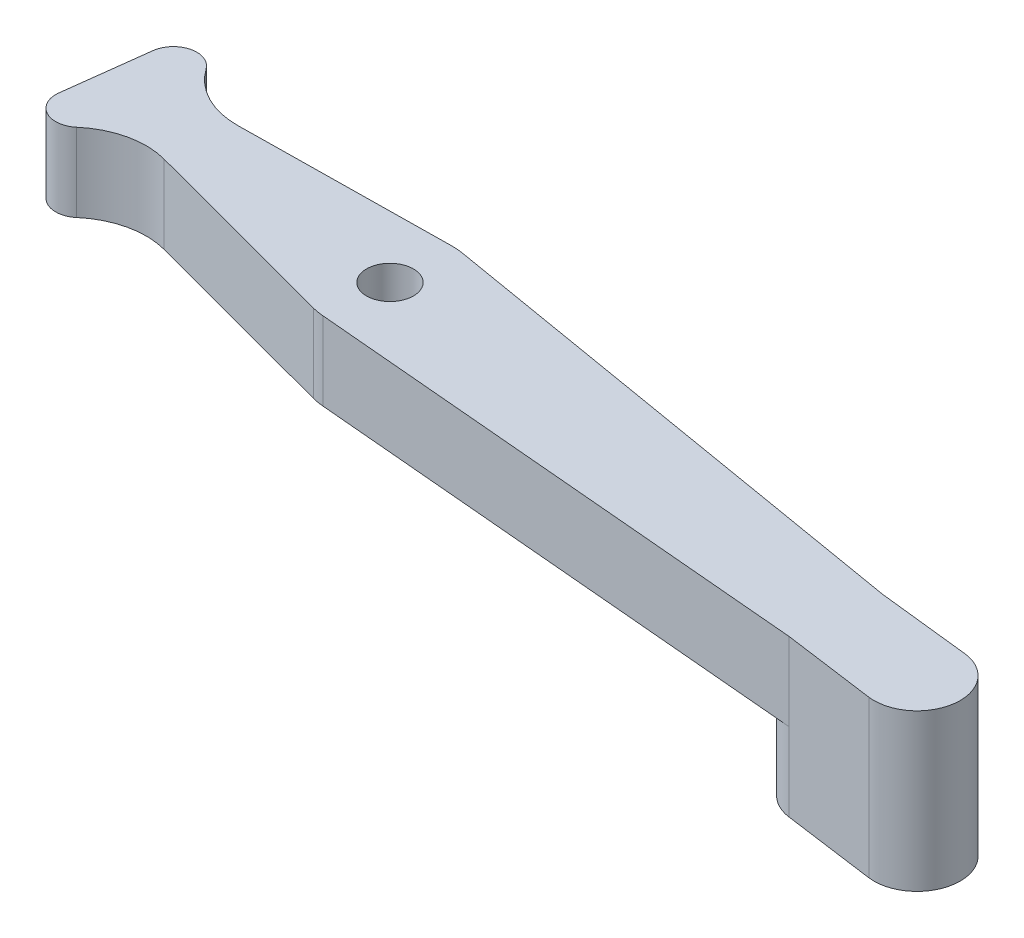
ISO-10303-21;
HEADER;
FILE_DESCRIPTION(('STEP AP214'),'2;1');
FILE_NAME('part.step','',(''),(''),'','','');
FILE_SCHEMA(('AUTOMOTIVE_DESIGN { 1 0 10303 214 1 1 1 1 }'));
ENDSEC;
DATA;
#1=APPLICATION_CONTEXT('core data for automotive mechanical design processes');
#2=APPLICATION_PROTOCOL_DEFINITION('international standard','automotive_design',2000,#1);
#3=PRODUCT_CONTEXT('',#1,'mechanical');
#4=PRODUCT('Part','Part','',(#3));
#5=PRODUCT_RELATED_PRODUCT_CATEGORY('part','',(#4));
#6=PRODUCT_DEFINITION_FORMATION('','',#4);
#7=PRODUCT_DEFINITION_CONTEXT('part definition',#1,'design');
#8=PRODUCT_DEFINITION('design','',#6,#7);
#9=PRODUCT_DEFINITION_SHAPE('','',#8);
#10=(LENGTH_UNIT() NAMED_UNIT(*) SI_UNIT(.MILLI.,.METRE.));
#11=(NAMED_UNIT(*) PLANE_ANGLE_UNIT() SI_UNIT($,.RADIAN.));
#12=(NAMED_UNIT(*) SI_UNIT($,.STERADIAN.) SOLID_ANGLE_UNIT());
#13=UNCERTAINTY_MEASURE_WITH_UNIT(LENGTH_MEASURE(1.E-05),#10,'distance_accuracy_value','');
#14=(GEOMETRIC_REPRESENTATION_CONTEXT(3) GLOBAL_UNCERTAINTY_ASSIGNED_CONTEXT((#13)) GLOBAL_UNIT_ASSIGNED_CONTEXT((#10,
#11,#12)) REPRESENTATION_CONTEXT('',''));
#15=CARTESIAN_POINT('',(0.,0.,0.));
#16=DIRECTION('',(0.,0.,1.));
#17=DIRECTION('',(1.,0.,0.));
#18=AXIS2_PLACEMENT_3D('',#15,#16,#17);
#19=CARTESIAN_POINT('',(20.0000002980301,-3.575342465325,55.0000000000125));
#20=DIRECTION('',(0.,-1.,0.));
#21=DIRECTION('',(-0.342020143325666,0.,-0.939692620785909));
#22=AXIS2_PLACEMENT_3D('',#19,#20,#21);
#23=CYLINDRICAL_SURFACE('',#22,1.50000000000011);
#24=CARTESIAN_POINT('',(20.0000002980301,-3.575342465325,55.0000000000125));
#25=DIRECTION('',(0.,-1.,0.));
#26=DIRECTION('',(-0.342020143325666,0.,-0.939692620785909));
#27=AXIS2_PLACEMENT_3D('',#24,#25,#26);
#28=CIRCLE('',#27,1.50000000000011);
#29=CARTESIAN_POINT('',(20.5130305130186,-3.575342465325,56.4095389311913));
#30=VERTEX_POINT('',#29);
#31=EDGE_CURVE('E276',#30,#30,#28,.T.);
#32=ORIENTED_EDGE('',*,*,#31,.F.);
#33=DIRECTION('',(0.,-1.,0.));
#34=VECTOR('',#33,1.);
#35=CARTESIAN_POINT('',(20.5130305130186,-3.575342465325,56.4095389311913));
#36=LINE('',#35,#34);
#37=CARTESIAN_POINT('',(20.5130305130186,-8.575342465325,56.4095389311913));
#38=VERTEX_POINT('',#37);
#39=EDGE_CURVE('E11',#30,#38,#36,.T.);
#40=ORIENTED_EDGE('',*,*,#39,.T.);
#41=CARTESIAN_POINT('',(20.0000002980301,-8.575342465325,55.0000000000125));
#42=DIRECTION('',(0.,-1.,0.));
#43=DIRECTION('',(-0.342020143325666,0.,-0.939692620785909));
#44=AXIS2_PLACEMENT_3D('',#41,#42,#43);
#45=CIRCLE('',#44,1.50000000000011);
#46=EDGE_CURVE('E267',#38,#38,#45,.T.);
#47=ORIENTED_EDGE('',*,*,#46,.T.);
#48=ORIENTED_EDGE('',*,*,#39,.F.);
#49=EDGE_LOOP('',(#32,#40,#47,#48));
#50=FACE_BOUND('',#49,.T.);
#51=ADVANCED_FACE('F17',(#50),#23,.F.);
#52=CARTESIAN_POINT('',(58.6145129467748,-13.575342465325,59.9186635199198));
#53=DIRECTION('',(0.,-1.,0.));
#54=DIRECTION('',(0.939692620785909,0.,-0.342020143325666));
#55=AXIS2_PLACEMENT_3D('',#52,#53,#54);
#56=PLANE('',#55);
#57=CARTESIAN_POINT('',(58.6145129467748,-13.575342465325,59.9186635199198));
#58=DIRECTION('',(0.,-1.,0.));
#59=DIRECTION('',(-0.342020143325666,0.,-0.939692620785909));
#60=AXIS2_PLACEMENT_3D('',#57,#58,#59);
#61=CIRCLE('',#60,2.75858306206178);
#62=CARTESIAN_POINT('',(58.9565307711655,-13.575342465325,57.1813647934204));
#63=VERTEX_POINT('',#62);
#64=CARTESIAN_POINT('',(58.2724951223841,-13.575342465325,62.655962246419));
#65=VERTEX_POINT('',#64);
#66=EDGE_CURVE('E178',#63,#65,#61,.T.);
#67=ORIENTED_EDGE('',*,*,#66,.T.);
#68=DIRECTION('',(-0.990669212726332,0.,-0.136288337564849));
#69=VECTOR('',#68,1.);
#70=CARTESIAN_POINT('',(52.3581257480847,-13.575342465325,61.8423106668508));
#71=LINE('',#70,#69);
#72=CARTESIAN_POINT('',(52.3581257480847,-13.575342465325,61.8423106668508));
#73=VERTEX_POINT('',#72);
#74=EDGE_CURVE('E184',#65,#73,#71,.T.);
#75=ORIENTED_EDGE('',*,*,#74,.T.);
#76=CARTESIAN_POINT('',(52.6906053268839,-13.575342465325,59.1816923708567));
#77=DIRECTION('',(0.,-1.,0.));
#78=DIRECTION('',(-0.342020143325666,0.,-0.939692620785909));
#79=AXIS2_PLACEMENT_3D('',#76,#77,#78);
#80=CIRCLE('',#79,2.68131169156073);
#81=CARTESIAN_POINT('',(53.0230849056696,-13.575342465325,56.5210740748565));
#82=VERTEX_POINT('',#81);
#83=EDGE_CURVE('E28',#73,#82,#80,.T.);
#84=ORIENTED_EDGE('',*,*,#83,.T.);
#85=DIRECTION('',(0.993864987501234,0.,0.110600120339779));
#86=VECTOR('',#85,1.);
#87=CARTESIAN_POINT('',(53.0230849056696,-13.575342465325,56.5210740748565));
#88=LINE('',#87,#86);
#89=EDGE_CURVE('E199',#82,#63,#88,.T.);
#90=ORIENTED_EDGE('',*,*,#89,.T.);
#91=EDGE_LOOP('',(#67,#75,#84,#90));
#92=FACE_BOUND('',#91,.T.);
#93=ADVANCED_FACE('F426',(#92),#56,.T.);
#94=CARTESIAN_POINT('',(52.6906053268839,-13.575342465325,59.1816923708567));
#95=DIRECTION('',(0.,1.,0.));
#96=DIRECTION('',(-0.992282361043559,0.,-0.123998854679468));
#97=AXIS2_PLACEMENT_3D('',#94,#95,#96);
#98=CYLINDRICAL_SURFACE('',#97,2.68131169156073);
#99=CARTESIAN_POINT('',(52.6906053268839,-8.575342465325,59.1816923708567));
#100=DIRECTION('',(0.,-1.,0.));
#101=DIRECTION('',(-0.342020143325666,0.,-0.939692620785909));
#102=AXIS2_PLACEMENT_3D('',#99,#100,#101);
#103=CIRCLE('',#102,2.68131169156073);
#104=CARTESIAN_POINT('',(52.3581257480847,-8.575342465325,61.8423106668508));
#105=VERTEX_POINT('',#104);
#106=CARTESIAN_POINT('',(53.0230849056696,-8.575342465325,56.5210740748565));
#107=VERTEX_POINT('',#106);
#108=EDGE_CURVE('E109',#105,#107,#103,.T.);
#109=ORIENTED_EDGE('',*,*,#108,.T.);
#110=DIRECTION('',(0.,1.,0.));
#111=VECTOR('',#110,1.);
#112=CARTESIAN_POINT('',(53.0230849056696,-13.575342465325,56.5210740748565));
#113=LINE('',#112,#111);
#114=EDGE_CURVE('E193',#82,#107,#113,.T.);
#115=ORIENTED_EDGE('',*,*,#114,.F.);
#116=ORIENTED_EDGE('',*,*,#83,.F.);
#117=DIRECTION('',(0.,1.,0.));
#118=VECTOR('',#117,1.);
#119=CARTESIAN_POINT('',(52.3581257480847,-13.575342465325,61.8423106668508));
#120=LINE('',#119,#118);
#121=EDGE_CURVE('E177',#73,#105,#120,.T.);
#122=ORIENTED_EDGE('',*,*,#121,.T.);
#123=EDGE_LOOP('',(#109,#115,#116,#122));
#124=FACE_BOUND('',#123,.T.);
#125=ADVANCED_FACE('F431',(#124),#98,.T.);
#126=CARTESIAN_POINT('',(20.0022288875852,-3.575342465325,55.0000201290001));
#127=DIRECTION('',(0.,-1.,0.));
#128=DIRECTION('',(0.939692620785909,0.,-0.342020143325666));
#129=AXIS2_PLACEMENT_3D('',#126,#127,#128);
#130=PLANE('',#129);
#131=ORIENTED_EDGE('',*,*,#31,.T.);
#132=EDGE_LOOP('',(#131));
#133=FACE_BOUND('',#132,.T.);
#134=DIRECTION('',(-0.996203883243687,0.,-0.0870506921867888));
#135=VECTOR('',#134,1.);
#136=CARTESIAN_POINT('',(52.3581257480847,-3.575342465325,61.8423106668508));
#137=LINE('',#136,#135);
#138=CARTESIAN_POINT('',(52.3581257480847,-3.575342465325,61.8423106668508));
#139=VERTEX_POINT('',#138);
#140=CARTESIAN_POINT('',(19.701769452364,-3.575342465325,58.9887196824597));
#141=VERTEX_POINT('',#140);
#142=EDGE_CURVE('E172',#139,#141,#137,.T.);
#143=ORIENTED_EDGE('',*,*,#142,.F.);
#144=DIRECTION('',(-0.990669212726332,0.,-0.136288337564849));
#145=VECTOR('',#144,1.);
#146=CARTESIAN_POINT('',(52.3581257480847,-3.575342465325,61.8423106668508));
#147=LINE('',#146,#145);
#148=CARTESIAN_POINT('',(58.2724951223841,-3.575342465325,62.655962246419));
#149=VERTEX_POINT('',#148);
#150=EDGE_CURVE('E168',#149,#139,#147,.T.);
#151=ORIENTED_EDGE('',*,*,#150,.F.);
#152=CARTESIAN_POINT('',(58.6145129467748,-3.575342465325,59.9186635199198));
#153=DIRECTION('',(0.,-1.,0.));
#154=DIRECTION('',(-0.342020143325666,0.,-0.939692620785909));
#155=AXIS2_PLACEMENT_3D('',#152,#153,#154);
#156=CIRCLE('',#155,2.75858306206178);
#157=CARTESIAN_POINT('',(58.9565307711655,-3.575342465325,57.1813647934204));
#158=VERTEX_POINT('',#157);
#159=EDGE_CURVE('E100',#158,#149,#156,.T.);
#160=ORIENTED_EDGE('',*,*,#159,.F.);
#161=DIRECTION('',(0.993864987501234,0.,0.110600120339779));
#162=VECTOR('',#161,1.);
#163=CARTESIAN_POINT('',(53.0230849056696,-3.575342465325,56.5210740748565));
#164=LINE('',#163,#162);
#165=CARTESIAN_POINT('',(53.0230849056696,-3.575342465325,56.5210740748565));
#166=VERTEX_POINT('',#165);
#167=EDGE_CURVE('E118',#166,#158,#164,.T.);
#168=ORIENTED_EDGE('',*,*,#167,.F.);
#169=DIRECTION('',(0.986034926068346,0.,0.16653865789477));
#170=VECTOR('',#169,1.);
#171=CARTESIAN_POINT('',(53.0230849056696,-3.575342465325,56.5210740748565));
#172=LINE('',#171,#170);
#173=CARTESIAN_POINT('',(20.6881800328054,-3.575342465325,51.0597952516503));
#174=VERTEX_POINT('',#173);
#175=EDGE_CURVE('E321',#174,#166,#172,.T.);
#176=ORIENTED_EDGE('',*,*,#175,.F.);
#177=CARTESIAN_POINT('',(20.0021659115954,-3.575342465325,55.0005292728054));
#178=DIRECTION('',(0.,-1.,0.));
#179=DIRECTION('',(-0.342020143325666,0.,-0.939692620785909));
#180=AXIS2_PLACEMENT_3D('',#177,#178,#179);
#181=CIRCLE('',#180,3.99999999999873);
#182=CARTESIAN_POINT('',(19.9496924531748,-3.575342465325,51.0008734705957));
#183=VERTEX_POINT('',#182);
#184=EDGE_CURVE('E240',#183,#174,#181,.T.);
#185=ORIENTED_EDGE('',*,*,#184,.F.);
#186=DIRECTION('',(0.999913950552803,0.,-0.01311836460412));
#187=VECTOR('',#186,1.);
#188=CARTESIAN_POINT('',(19.9496924531748,-3.575342465325,51.0008734705957));
#189=LINE('',#188,#187);
#190=CARTESIAN_POINT('',(6.45819009249271,-3.575342465325,51.1778751485163));
#191=VERTEX_POINT('',#190);
#192=EDGE_CURVE('E212',#191,#183,#189,.T.);
#193=ORIENTED_EDGE('',*,*,#192,.F.);
#194=CARTESIAN_POINT('',(6.39259826947036,-3.575342465325,46.1783053957504));
#195=DIRECTION('',(0.,1.,0.));
#196=DIRECTION('',(-0.342020143325666,0.,-0.939692620785909));
#197=AXIS2_PLACEMENT_3D('',#194,#195,#196);
#198=CIRCLE('',#197,5.);
#199=CARTESIAN_POINT('',(2.30713785675141,-3.575342465325,49.0608412959725));
#200=VERTEX_POINT('',#199);
#201=EDGE_CURVE('E226',#200,#191,#198,.T.);
#202=ORIENTED_EDGE('',*,*,#201,.F.);
#203=CARTESIAN_POINT('',(1.08149973293292,-3.575342465325,49.9256020660472));
#204=DIRECTION('',(0.,-1.,0.));
#205=DIRECTION('',(-0.342020143325666,0.,-0.939692620785909));
#206=AXIS2_PLACEMENT_3D('',#203,#204,#205);
#207=CIRCLE('',#206,1.50000000000034);
#208=CARTESIAN_POINT('',(-0.407025501957481,-3.575342465325,49.7404193857111));
#209=VERTEX_POINT('',#208);
#210=EDGE_CURVE('E325',#209,#200,#207,.T.);
#211=ORIENTED_EDGE('',*,*,#210,.F.);
#212=DIRECTION('',(0.123455120224889,0.,-0.992350156593054));
#213=VECTOR('',#212,1.);
#214=CARTESIAN_POINT('',(-0.740338216524972,-3.575342465325,52.4196353137164));
#215=LINE('',#214,#213);
#216=CARTESIAN_POINT('',(-1.0736827481117,-3.575342465325,55.0991109809027));
#217=VERTEX_POINT('',#216);
#218=EDGE_CURVE('E21',#217,#209,#215,.T.);
#219=ORIENTED_EDGE('',*,*,#218,.F.);
#220=CARTESIAN_POINT('',(0.414843066640191,-3.575342465325,55.2842929859916));
#221=DIRECTION('',(0.,-1.,0.));
#222=DIRECTION('',(-0.342020143325666,0.,-0.939692620785909));
#223=AXIS2_PLACEMENT_3D('',#220,#221,#222);
#224=CIRCLE('',#223,1.50000000000005);
#225=CARTESIAN_POINT('',(1.39123653535167,-3.575342465325,56.4230009354849));
#226=VERTEX_POINT('',#225);
#227=EDGE_CURVE('E294',#226,#217,#224,.T.);
#228=ORIENTED_EDGE('',*,*,#227,.F.);
#229=CARTESIAN_POINT('',(4.64588143107614,-3.575342465325,60.2186941004763));
#230=DIRECTION('',(0.,1.,0.));
#231=DIRECTION('',(-0.342020143325666,0.,-0.939692620785909));
#232=AXIS2_PLACEMENT_3D('',#229,#230,#231);
#233=CIRCLE('',#232,4.99999999999978);
#234=CARTESIAN_POINT('',(5.93447313264361,-3.575342465325,55.3875936640682));
#235=VERTEX_POINT('',#234);
#236=EDGE_CURVE('E274',#235,#226,#233,.T.);
#237=ORIENTED_EDGE('',*,*,#236,.F.);
#238=DIRECTION('',(-0.966220087281166,0.,-0.257718340314338));
#239=VECTOR('',#238,1.);
#240=CARTESIAN_POINT('',(18.9713555376572,-3.575342465325,58.864900481147));
#241=LINE('',#240,#239);
#242=CARTESIAN_POINT('',(18.9713555376572,-3.575342465325,58.864900481147));
#243=VERTEX_POINT('',#242);
#244=EDGE_CURVE('E254',#243,#235,#241,.T.);
#245=ORIENTED_EDGE('',*,*,#244,.F.);
#246=CARTESIAN_POINT('',(20.0022288875852,-3.575342465325,55.0000201290001));
#247=DIRECTION('',(0.,-1.,0.));
#248=DIRECTION('',(-0.342020143325666,0.,-0.939692620785909));
#249=AXIS2_PLACEMENT_3D('',#246,#247,#248);
#250=CIRCLE('',#249,4.00000000000018);
#251=EDGE_CURVE('E208',#141,#243,#250,.T.);
#252=ORIENTED_EDGE('',*,*,#251,.F.);
#253=EDGE_LOOP('',(#143,#151,#160,#168,#176,#185,#193,#202,#211,#219,#228,#237,#245,#252));
#254=FACE_BOUND('',#253,.T.);
#255=ADVANCED_FACE('F170',(#133,#254),#130,.F.);
#256=CARTESIAN_POINT('',(20.0022288875852,-8.575342465325,55.0000201290001));
#257=DIRECTION('',(0.,-1.,0.));
#258=DIRECTION('',(0.939692620785909,0.,-0.342020143325666));
#259=AXIS2_PLACEMENT_3D('',#256,#257,#258);
#260=PLANE('',#259);
#261=ORIENTED_EDGE('',*,*,#46,.F.);
#262=EDGE_LOOP('',(#261));
#263=FACE_BOUND('',#262,.T.);
#264=ORIENTED_EDGE('',*,*,#108,.F.);
#265=DIRECTION('',(-0.996203883243687,0.,-0.0870506921867888));
#266=VECTOR('',#265,1.);
#267=CARTESIAN_POINT('',(52.3581257480847,-8.575342465325,61.8423106668508));
#268=LINE('',#267,#266);
#269=CARTESIAN_POINT('',(19.701769452364,-8.575342465325,58.9887196824597));
#270=VERTEX_POINT('',#269);
#271=EDGE_CURVE('E203',#105,#270,#268,.T.);
#272=ORIENTED_EDGE('',*,*,#271,.T.);
#273=CARTESIAN_POINT('',(20.0022288875852,-8.575342465325,55.0000201290001));
#274=DIRECTION('',(0.,-1.,0.));
#275=DIRECTION('',(-0.342020143325666,0.,-0.939692620785909));
#276=AXIS2_PLACEMENT_3D('',#273,#274,#275);
#277=CIRCLE('',#276,4.00000000000018);
#278=CARTESIAN_POINT('',(18.9713555376572,-8.575342465325,58.864900481147));
#279=VERTEX_POINT('',#278);
#280=EDGE_CURVE('E334',#270,#279,#277,.T.);
#281=ORIENTED_EDGE('',*,*,#280,.T.);
#282=DIRECTION('',(-0.966220087281166,0.,-0.257718340314338));
#283=VECTOR('',#282,1.);
#284=CARTESIAN_POINT('',(18.9713555376572,-8.575342465325,58.864900481147));
#285=LINE('',#284,#283);
#286=CARTESIAN_POINT('',(5.93447313264361,-8.575342465325,55.3875936640682));
#287=VERTEX_POINT('',#286);
#288=EDGE_CURVE('E253',#279,#287,#285,.T.);
#289=ORIENTED_EDGE('',*,*,#288,.T.);
#290=CARTESIAN_POINT('',(4.64588143107614,-8.575342465325,60.2186941004763));
#291=DIRECTION('',(0.,1.,0.));
#292=DIRECTION('',(-0.342020143325666,0.,-0.939692620785909));
#293=AXIS2_PLACEMENT_3D('',#290,#291,#292);
#294=CIRCLE('',#293,4.99999999999978);
#295=CARTESIAN_POINT('',(1.39123653535167,-8.575342465325,56.4230009354849));
#296=VERTEX_POINT('',#295);
#297=EDGE_CURVE('E305',#287,#296,#294,.T.);
#298=ORIENTED_EDGE('',*,*,#297,.T.);
#299=CARTESIAN_POINT('',(0.414843066640191,-8.575342465325,55.2842929859916));
#300=DIRECTION('',(0.,-1.,0.));
#301=DIRECTION('',(-0.342020143325666,0.,-0.939692620785909));
#302=AXIS2_PLACEMENT_3D('',#299,#300,#301);
#303=CIRCLE('',#302,1.50000000000005);
#304=CARTESIAN_POINT('',(-1.0736827481117,-8.575342465325,55.0991109809027));
#305=VERTEX_POINT('',#304);
#306=EDGE_CURVE('E293',#296,#305,#303,.T.);
#307=ORIENTED_EDGE('',*,*,#306,.T.);
#308=DIRECTION('',(0.123455120224889,0.,-0.992350156593054));
#309=VECTOR('',#308,1.);
#310=CARTESIAN_POINT('',(-0.740338216524972,-8.575342465325,52.4196353137164));
#311=LINE('',#310,#309);
#312=CARTESIAN_POINT('',(-0.407025501957481,-8.575342465325,49.7404193857111));
#313=VERTEX_POINT('',#312);
#314=EDGE_CURVE('E289',#305,#313,#311,.T.);
#315=ORIENTED_EDGE('',*,*,#314,.T.);
#316=CARTESIAN_POINT('',(1.08149973293292,-8.575342465325,49.9256020660472));
#317=DIRECTION('',(0.,-1.,0.));
#318=DIRECTION('',(-0.342020143325666,0.,-0.939692620785909));
#319=AXIS2_PLACEMENT_3D('',#316,#317,#318);
#320=CIRCLE('',#319,1.50000000000034);
#321=CARTESIAN_POINT('',(2.30713785675141,-8.575342465325,49.0608412959725));
#322=VERTEX_POINT('',#321);
#323=EDGE_CURVE('E233',#313,#322,#320,.T.);
#324=ORIENTED_EDGE('',*,*,#323,.T.);
#325=CARTESIAN_POINT('',(6.39259826947036,-8.575342465325,46.1783053957504));
#326=DIRECTION('',(0.,1.,0.));
#327=DIRECTION('',(-0.342020143325666,0.,-0.939692620785909));
#328=AXIS2_PLACEMENT_3D('',#325,#326,#327);
#329=CIRCLE('',#328,5.);
#330=CARTESIAN_POINT('',(6.45819009249271,-8.575342465325,51.1778751485163));
#331=VERTEX_POINT('',#330);
#332=EDGE_CURVE('E209',#322,#331,#329,.T.);
#333=ORIENTED_EDGE('',*,*,#332,.T.);
#334=DIRECTION('',(0.999913950552803,0.,-0.01311836460412));
#335=VECTOR('',#334,1.);
#336=CARTESIAN_POINT('',(19.9496924531748,-8.575342465325,51.0008734705957));
#337=LINE('',#336,#335);
#338=CARTESIAN_POINT('',(19.9496924531748,-8.575342465325,51.0008734705957));
#339=VERTEX_POINT('',#338);
#340=EDGE_CURVE('E237',#331,#339,#337,.T.);
#341=ORIENTED_EDGE('',*,*,#340,.T.);
#342=CARTESIAN_POINT('',(20.0021659115954,-8.575342465325,55.0005292728054));
#343=DIRECTION('',(0.,-1.,0.));
#344=DIRECTION('',(-0.342020143325666,0.,-0.939692620785909));
#345=AXIS2_PLACEMENT_3D('',#342,#343,#344);
#346=CIRCLE('',#345,3.99999999999873);
#347=CARTESIAN_POINT('',(20.6881800328054,-8.575342465325,51.0597952516503));
#348=VERTEX_POINT('',#347);
#349=EDGE_CURVE('E248',#339,#348,#346,.T.);
#350=ORIENTED_EDGE('',*,*,#349,.T.);
#351=DIRECTION('',(0.986034926068346,0.,0.16653865789477));
#352=VECTOR('',#351,1.);
#353=CARTESIAN_POINT('',(53.0230849056696,-8.575342465325,56.5210740748565));
#354=LINE('',#353,#352);
#355=EDGE_CURVE('E255',#348,#107,#354,.T.);
#356=ORIENTED_EDGE('',*,*,#355,.T.);
#357=EDGE_LOOP('',(#264,#272,#281,#289,#298,#307,#315,#324,#333,#341,#350,#356));
#358=FACE_BOUND('',#357,.T.);
#359=ADVANCED_FACE('F449',(#263,#358),#260,.T.);
#360=CARTESIAN_POINT('',(52.3581257480847,-8.575342465325,61.8423106668508));
#361=DIRECTION('',(0.136288337564849,0.,-0.990669212726332));
#362=DIRECTION('',(0.,1.,0.));
#363=AXIS2_PLACEMENT_3D('',#360,#361,#362);
#364=PLANE('',#363);
#365=ORIENTED_EDGE('',*,*,#150,.T.);
#366=DIRECTION('',(0.,1.,0.));
#367=VECTOR('',#366,1.);
#368=CARTESIAN_POINT('',(52.3581257480847,-8.575342465325,61.8423106668508));
#369=LINE('',#368,#367);
#370=EDGE_CURVE('E205',#105,#139,#369,.T.);
#371=ORIENTED_EDGE('',*,*,#370,.F.);
#372=ORIENTED_EDGE('',*,*,#121,.F.);
#373=ORIENTED_EDGE('',*,*,#74,.F.);
#374=DIRECTION('',(0.,1.,0.));
#375=VECTOR('',#374,1.);
#376=CARTESIAN_POINT('',(58.2724951223841,-8.575342465325,62.655962246419));
#377=LINE('',#376,#375);
#378=EDGE_CURVE('E180',#65,#149,#377,.T.);
#379=ORIENTED_EDGE('',*,*,#378,.T.);
#380=EDGE_LOOP('',(#365,#371,#372,#373,#379));
#381=FACE_BOUND('',#380,.T.);
#382=ADVANCED_FACE('F181',(#381),#364,.F.);
#383=CARTESIAN_POINT('',(58.6145129467748,-8.575342465325,59.9186635199198));
#384=DIRECTION('',(0.,1.,0.));
#385=DIRECTION('',(0.342020143325666,0.,0.939692620785909));
#386=AXIS2_PLACEMENT_3D('',#383,#384,#385);
#387=CYLINDRICAL_SURFACE('',#386,2.75858306206178);
#388=ORIENTED_EDGE('',*,*,#159,.T.);
#389=ORIENTED_EDGE('',*,*,#378,.F.);
#390=ORIENTED_EDGE('',*,*,#66,.F.);
#391=DIRECTION('',(0.,1.,0.));
#392=VECTOR('',#391,1.);
#393=CARTESIAN_POINT('',(58.9565307711655,-8.575342465325,57.1813647934204));
#394=LINE('',#393,#392);
#395=EDGE_CURVE('E191',#63,#158,#394,.T.);
#396=ORIENTED_EDGE('',*,*,#395,.T.);
#397=EDGE_LOOP('',(#388,#389,#390,#396));
#398=FACE_BOUND('',#397,.T.);
#399=ADVANCED_FACE('F189',(#398),#387,.T.);
#400=CARTESIAN_POINT('',(53.0230849056696,-8.575342465325,56.5210740748565));
#401=DIRECTION('',(-0.110600120339779,0.,0.993864987501234));
#402=DIRECTION('',(0.,-1.,0.));
#403=AXIS2_PLACEMENT_3D('',#400,#401,#402);
#404=PLANE('',#403);
#405=ORIENTED_EDGE('',*,*,#167,.T.);
#406=ORIENTED_EDGE('',*,*,#395,.F.);
#407=ORIENTED_EDGE('',*,*,#89,.F.);
#408=ORIENTED_EDGE('',*,*,#114,.T.);
#409=DIRECTION('',(0.,1.,0.));
#410=VECTOR('',#409,1.);
#411=CARTESIAN_POINT('',(53.0230849056696,-8.575342465325,56.5210740748565));
#412=LINE('',#411,#410);
#413=EDGE_CURVE('E259',#107,#166,#412,.T.);
#414=ORIENTED_EDGE('',*,*,#413,.T.);
#415=EDGE_LOOP('',(#405,#406,#407,#408,#414));
#416=FACE_BOUND('',#415,.T.);
#417=ADVANCED_FACE('F347',(#416),#404,.F.);
#418=CARTESIAN_POINT('',(53.0230849056696,-8.575342465325,56.5210740748565));
#419=DIRECTION('',(-0.16653865789477,0.,0.986034926068346));
#420=DIRECTION('',(0.,-1.,0.));
#421=AXIS2_PLACEMENT_3D('',#418,#419,#420);
#422=PLANE('',#421);
#423=ORIENTED_EDGE('',*,*,#175,.T.);
#424=ORIENTED_EDGE('',*,*,#413,.F.);
#425=ORIENTED_EDGE('',*,*,#355,.F.);
#426=DIRECTION('',(0.,1.,0.));
#427=VECTOR('',#426,1.);
#428=CARTESIAN_POINT('',(20.6881800328054,-8.575342465325,51.0597952516503));
#429=LINE('',#428,#427);
#430=EDGE_CURVE('E244',#348,#174,#429,.T.);
#431=ORIENTED_EDGE('',*,*,#430,.T.);
#432=EDGE_LOOP('',(#423,#424,#425,#431));
#433=FACE_BOUND('',#432,.T.);
#434=ADVANCED_FACE('F353',(#433),#422,.F.);
#435=CARTESIAN_POINT('',(20.0021659115954,-8.575342465325,55.0005292728054));
#436=DIRECTION('',(0.,1.,0.));
#437=DIRECTION('',(0.342020143325666,0.,0.939692620785909));
#438=AXIS2_PLACEMENT_3D('',#435,#436,#437);
#439=CYLINDRICAL_SURFACE('',#438,3.99999999999873);
#440=ORIENTED_EDGE('',*,*,#184,.T.);
#441=ORIENTED_EDGE('',*,*,#430,.F.);
#442=ORIENTED_EDGE('',*,*,#349,.F.);
#443=DIRECTION('',(0.,1.,0.));
#444=VECTOR('',#443,1.);
#445=CARTESIAN_POINT('',(19.9496924531748,-8.575342465325,51.0008734705957));
#446=LINE('',#445,#444);
#447=EDGE_CURVE('E223',#339,#183,#446,.T.);
#448=ORIENTED_EDGE('',*,*,#447,.T.);
#449=EDGE_LOOP('',(#440,#441,#442,#448));
#450=FACE_BOUND('',#449,.T.);
#451=ADVANCED_FACE('F19',(#450),#439,.T.);
#452=CARTESIAN_POINT('',(19.9496924531748,-8.575342465325,51.0008734705957));
#453=DIRECTION('',(0.01311836460412,0.,0.999913950552803));
#454=DIRECTION('',(0.,-1.,0.));
#455=AXIS2_PLACEMENT_3D('',#452,#453,#454);
#456=PLANE('',#455);
#457=ORIENTED_EDGE('',*,*,#192,.T.);
#458=ORIENTED_EDGE('',*,*,#447,.F.);
#459=ORIENTED_EDGE('',*,*,#340,.F.);
#460=DIRECTION('',(0.,1.,0.));
#461=VECTOR('',#460,1.);
#462=CARTESIAN_POINT('',(6.45819009249271,-8.575342465325,51.1778751485163));
#463=LINE('',#462,#461);
#464=EDGE_CURVE('E213',#331,#191,#463,.T.);
#465=ORIENTED_EDGE('',*,*,#464,.T.);
#466=EDGE_LOOP('',(#457,#458,#459,#465));
#467=FACE_BOUND('',#466,.T.);
#468=ADVANCED_FACE('F411',(#467),#456,.F.);
#469=CARTESIAN_POINT('',(6.39259826947036,-8.575342465325,46.1783053957504));
#470=DIRECTION('',(0.,1.,0.));
#471=DIRECTION('',(0.342020143325666,0.,0.939692620785909));
#472=AXIS2_PLACEMENT_3D('',#469,#470,#471);
#473=CYLINDRICAL_SURFACE('',#472,5.);
#474=ORIENTED_EDGE('',*,*,#201,.T.);
#475=ORIENTED_EDGE('',*,*,#464,.F.);
#476=ORIENTED_EDGE('',*,*,#332,.F.);
#477=DIRECTION('',(0.,1.,0.));
#478=VECTOR('',#477,1.);
#479=CARTESIAN_POINT('',(2.30713785675141,-8.575342465325,49.0608412959725));
#480=LINE('',#479,#478);
#481=EDGE_CURVE('E317',#322,#200,#480,.T.);
#482=ORIENTED_EDGE('',*,*,#481,.T.);
#483=EDGE_LOOP('',(#474,#475,#476,#482));
#484=FACE_BOUND('',#483,.T.);
#485=ADVANCED_FACE('F413',(#484),#473,.F.);
#486=CARTESIAN_POINT('',(1.08149973293292,-8.575342465325,49.9256020660472));
#487=DIRECTION('',(0.,1.,0.));
#488=DIRECTION('',(-0.242884520621483,0.,-0.970055209584729));
#489=AXIS2_PLACEMENT_3D('',#486,#487,#488);
#490=CYLINDRICAL_SURFACE('',#489,1.50000000000034);
#491=ORIENTED_EDGE('',*,*,#210,.T.);
#492=ORIENTED_EDGE('',*,*,#481,.F.);
#493=ORIENTED_EDGE('',*,*,#323,.F.);
#494=DIRECTION('',(0.,1.,0.));
#495=VECTOR('',#494,1.);
#496=CARTESIAN_POINT('',(-0.407025501957481,-8.575342465325,49.7404193857111));
#497=LINE('',#496,#495);
#498=EDGE_CURVE('E286',#313,#209,#497,.T.);
#499=ORIENTED_EDGE('',*,*,#498,.T.);
#500=EDGE_LOOP('',(#491,#492,#493,#499));
#501=FACE_BOUND('',#500,.T.);
#502=ADVANCED_FACE('F420',(#501),#490,.T.);
#503=CARTESIAN_POINT('',(-0.740354369407559,-8.575342465325,52.4197651528984));
#504=DIRECTION('',(0.992350156593054,0.,0.123455120224889));
#505=DIRECTION('',(0.,1.,0.));
#506=AXIS2_PLACEMENT_3D('',#503,#504,#505);
#507=PLANE('',#506);
#508=ORIENTED_EDGE('',*,*,#218,.T.);
#509=ORIENTED_EDGE('',*,*,#498,.F.);
#510=ORIENTED_EDGE('',*,*,#314,.F.);
#511=DIRECTION('',(0.,1.,0.));
#512=VECTOR('',#511,1.);
#513=CARTESIAN_POINT('',(-1.07368225981741,-8.575342465325,55.0991110416496));
#514=LINE('',#513,#512);
#515=EDGE_CURVE('E290',#305,#217,#514,.T.);
#516=ORIENTED_EDGE('',*,*,#515,.T.);
#517=EDGE_LOOP('',(#508,#509,#510,#516));
#518=FACE_BOUND('',#517,.T.);
#519=ADVANCED_FACE('F439',(#518),#507,.F.);
#520=CARTESIAN_POINT('',(0.414843066640191,-8.575342465325,55.2842929859916));
#521=DIRECTION('',(0.,1.,0.));
#522=DIRECTION('',(0.342020143325666,0.,0.939692620785909));
#523=AXIS2_PLACEMENT_3D('',#520,#521,#522);
#524=CYLINDRICAL_SURFACE('',#523,1.50000000000005);
#525=ORIENTED_EDGE('',*,*,#227,.T.);
#526=ORIENTED_EDGE('',*,*,#515,.F.);
#527=ORIENTED_EDGE('',*,*,#306,.F.);
#528=DIRECTION('',(0.,1.,0.));
#529=VECTOR('',#528,1.);
#530=CARTESIAN_POINT('',(1.39123653535167,-8.575342465325,56.4230009354849));
#531=LINE('',#530,#529);
#532=EDGE_CURVE('E313',#296,#226,#531,.T.);
#533=ORIENTED_EDGE('',*,*,#532,.T.);
#534=EDGE_LOOP('',(#525,#526,#527,#533));
#535=FACE_BOUND('',#534,.T.);
#536=ADVANCED_FACE('F435',(#535),#524,.T.);
#537=CARTESIAN_POINT('',(4.64588143107614,-8.575342465325,60.2186941004763));
#538=DIRECTION('',(0.,1.,0.));
#539=DIRECTION('',(-0.222203361359682,0.,-0.975000341641201));
#540=AXIS2_PLACEMENT_3D('',#537,#538,#539);
#541=CYLINDRICAL_SURFACE('',#540,4.99999999999978);
#542=ORIENTED_EDGE('',*,*,#236,.T.);
#543=ORIENTED_EDGE('',*,*,#532,.F.);
#544=ORIENTED_EDGE('',*,*,#297,.F.);
#545=DIRECTION('',(0.,1.,0.));
#546=VECTOR('',#545,1.);
#547=CARTESIAN_POINT('',(5.93447313264361,-8.575342465325,55.3875936640682));
#548=LINE('',#547,#546);
#549=EDGE_CURVE('E249',#287,#235,#548,.T.);
#550=ORIENTED_EDGE('',*,*,#549,.T.);
#551=EDGE_LOOP('',(#542,#543,#544,#550));
#552=FACE_BOUND('',#551,.T.);
#553=ADVANCED_FACE('F438',(#552),#541,.F.);
#554=CARTESIAN_POINT('',(18.9713555376572,-8.575342465325,58.864900481147));
#555=DIRECTION('',(0.257718340314338,0.,-0.966220087281166));
#556=DIRECTION('',(0.,1.,0.));
#557=AXIS2_PLACEMENT_3D('',#554,#555,#556);
#558=PLANE('',#557);
#559=ORIENTED_EDGE('',*,*,#244,.T.);
#560=ORIENTED_EDGE('',*,*,#549,.F.);
#561=ORIENTED_EDGE('',*,*,#288,.F.);
#562=DIRECTION('',(0.,1.,0.));
#563=VECTOR('',#562,1.);
#564=CARTESIAN_POINT('',(18.9713555376572,-8.575342465325,58.864900481147));
#565=LINE('',#564,#563);
#566=EDGE_CURVE('E285',#279,#243,#565,.T.);
#567=ORIENTED_EDGE('',*,*,#566,.T.);
#568=EDGE_LOOP('',(#559,#560,#561,#567));
#569=FACE_BOUND('',#568,.T.);
#570=ADVANCED_FACE('F481',(#569),#558,.F.);
#571=CARTESIAN_POINT('',(20.0022288875852,-8.575342465325,55.0000201290001));
#572=DIRECTION('',(0.,1.,0.));
#573=DIRECTION('',(0.342020143325666,0.,0.939692620785909));
#574=AXIS2_PLACEMENT_3D('',#571,#572,#573);
#575=CYLINDRICAL_SURFACE('',#574,4.00000000000018);
#576=ORIENTED_EDGE('',*,*,#251,.T.);
#577=ORIENTED_EDGE('',*,*,#566,.F.);
#578=ORIENTED_EDGE('',*,*,#280,.F.);
#579=DIRECTION('',(0.,1.,0.));
#580=VECTOR('',#579,1.);
#581=CARTESIAN_POINT('',(19.701769452364,-8.575342465325,58.9887196824597));
#582=LINE('',#581,#580);
#583=EDGE_CURVE('E281',#270,#141,#582,.T.);
#584=ORIENTED_EDGE('',*,*,#583,.T.);
#585=EDGE_LOOP('',(#576,#577,#578,#584));
#586=FACE_BOUND('',#585,.T.);
#587=ADVANCED_FACE('F445',(#586),#575,.T.);
#588=CARTESIAN_POINT('',(52.3581257480847,-8.575342465325,61.8423106668508));
#589=DIRECTION('',(0.0870506921867888,0.,-0.996203883243687));
#590=DIRECTION('',(0.,1.,0.));
#591=AXIS2_PLACEMENT_3D('',#588,#589,#590);
#592=PLANE('',#591);
#593=ORIENTED_EDGE('',*,*,#142,.T.);
#594=ORIENTED_EDGE('',*,*,#583,.F.);
#595=ORIENTED_EDGE('',*,*,#271,.F.);
#596=ORIENTED_EDGE('',*,*,#370,.T.);
#597=EDGE_LOOP('',(#593,#594,#595,#596));
#598=FACE_BOUND('',#597,.T.);
#599=ADVANCED_FACE('F442',(#598),#592,.F.);
#600=CLOSED_SHELL('',(#51,#93,#125,#255,#359,#382,#399,#417,#434,#451,#468,#485,#502,#519,#536,
#553,#570,#587,#599));
#601=MANIFOLD_SOLID_BREP('B1',#600);
#602=ADVANCED_BREP_SHAPE_REPRESENTATION('',(#18,#601),#14);
#603=SHAPE_DEFINITION_REPRESENTATION(#9,#602);
ENDSEC;
END-ISO-10303-21;
